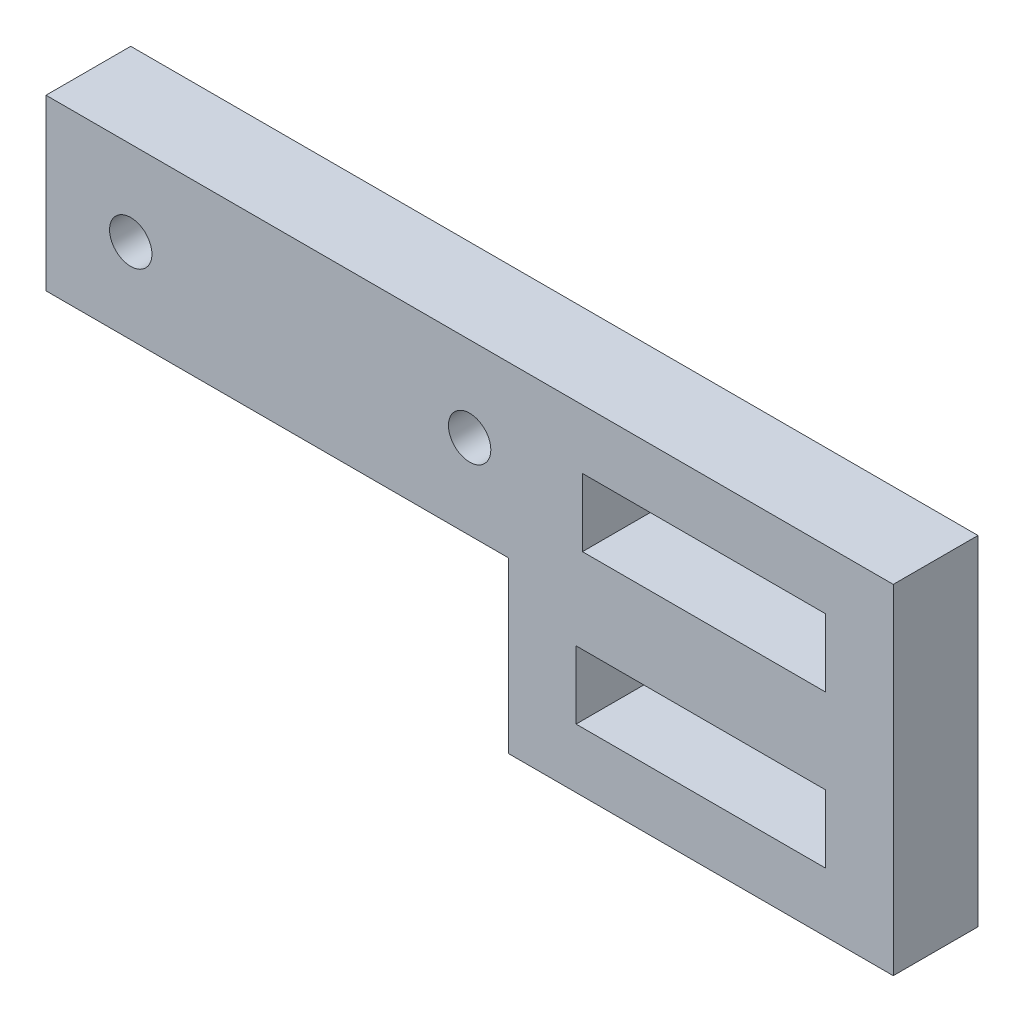
ISO-10303-21;
HEADER;
FILE_DESCRIPTION(('STEP AP214'),'2;1');
FILE_NAME('part.step','',(''),(''),'','','');
FILE_SCHEMA(('AUTOMOTIVE_DESIGN { 1 0 10303 214 1 1 1 1 }'));
ENDSEC;
DATA;
#1=APPLICATION_CONTEXT('core data for automotive mechanical design processes');
#2=APPLICATION_PROTOCOL_DEFINITION('international standard','automotive_design',2000,#1);
#3=PRODUCT_CONTEXT('',#1,'mechanical');
#4=PRODUCT('Part','Part','',(#3));
#5=PRODUCT_RELATED_PRODUCT_CATEGORY('part','',(#4));
#6=PRODUCT_DEFINITION_FORMATION('','',#4);
#7=PRODUCT_DEFINITION_CONTEXT('part definition',#1,'design');
#8=PRODUCT_DEFINITION('design','',#6,#7);
#9=PRODUCT_DEFINITION_SHAPE('','',#8);
#10=(LENGTH_UNIT() NAMED_UNIT(*) SI_UNIT(.MILLI.,.METRE.));
#11=(NAMED_UNIT(*) PLANE_ANGLE_UNIT() SI_UNIT($,.RADIAN.));
#12=(NAMED_UNIT(*) SI_UNIT($,.STERADIAN.) SOLID_ANGLE_UNIT());
#13=UNCERTAINTY_MEASURE_WITH_UNIT(LENGTH_MEASURE(1.E-05),#10,'distance_accuracy_value','');
#14=(GEOMETRIC_REPRESENTATION_CONTEXT(3) GLOBAL_UNCERTAINTY_ASSIGNED_CONTEXT((#13)) GLOBAL_UNIT_ASSIGNED_CONTEXT((#10,
#11,#12)) REPRESENTATION_CONTEXT('',''));
#15=CARTESIAN_POINT('',(0.,0.,0.));
#16=DIRECTION('',(0.,0.,1.));
#17=DIRECTION('',(1.,0.,0.));
#18=AXIS2_PLACEMENT_3D('',#15,#16,#17);
#19=CARTESIAN_POINT('',(-30.2834605430607,-8.38451020186061,6.35));
#20=DIRECTION('',(1.,0.,0.));
#21=DIRECTION('',(0.,1.,0.));
#22=AXIS2_PLACEMENT_3D('',#19,#20,#21);
#23=PLANE('',#22);
#24=DIRECTION('',(0.,-1.,0.));
#25=VECTOR('',#24,1.);
#26=CARTESIAN_POINT('',(-30.2834605430607,-8.38451020186061,0.));
#27=LINE('',#26,#25);
#28=CARTESIAN_POINT('',(-30.2834605430607,4.31548979813939,0.));
#29=VERTEX_POINT('',#28);
#30=CARTESIAN_POINT('',(-30.2834605430607,-8.38451020186061,0.));
#31=VERTEX_POINT('',#30);
#32=EDGE_CURVE('E257',#29,#31,#27,.T.);
#33=ORIENTED_EDGE('',*,*,#32,.T.);
#34=DIRECTION('',(0.,0.,-1.));
#35=VECTOR('',#34,1.);
#36=CARTESIAN_POINT('',(-30.2834605430607,-8.38451020186061,6.35));
#37=LINE('',#36,#35);
#38=CARTESIAN_POINT('',(-30.2834605430607,-8.38451020186061,6.35));
#39=VERTEX_POINT('',#38);
#40=EDGE_CURVE('E11',#39,#31,#37,.T.);
#41=ORIENTED_EDGE('',*,*,#40,.F.);
#42=DIRECTION('',(0.,-1.,0.));
#43=VECTOR('',#42,1.);
#44=CARTESIAN_POINT('',(-30.2834605430607,-8.38451020186061,6.35));
#45=LINE('',#44,#43);
#46=CARTESIAN_POINT('',(-30.2834605430607,4.31548979813939,6.35));
#47=VERTEX_POINT('',#46);
#48=EDGE_CURVE('E236',#47,#39,#45,.T.);
#49=ORIENTED_EDGE('',*,*,#48,.F.);
#50=DIRECTION('',(0.,0.,-1.));
#51=VECTOR('',#50,1.);
#52=CARTESIAN_POINT('',(-30.2834605430607,4.31548979813939,6.35));
#53=LINE('',#52,#51);
#54=EDGE_CURVE('E256',#47,#29,#53,.T.);
#55=ORIENTED_EDGE('',*,*,#54,.T.);
#56=EDGE_LOOP('',(#33,#41,#49,#55));
#57=FACE_BOUND('',#56,.T.);
#58=ADVANCED_FACE('F39',(#57),#23,.F.);
#59=CARTESIAN_POINT('',(4.36322997572279,-8.38451020186061,6.35));
#60=DIRECTION('',(0.,1.,0.));
#61=DIRECTION('',(-1.,0.,0.));
#62=AXIS2_PLACEMENT_3D('',#59,#60,#61);
#63=PLANE('',#62);
#64=DIRECTION('',(1.,0.,0.));
#65=VECTOR('',#64,1.);
#66=CARTESIAN_POINT('',(4.36322997572279,-8.38451020186061,0.));
#67=LINE('',#66,#65);
#68=CARTESIAN_POINT('',(4.36322997572279,-8.38451020186061,0.));
#69=VERTEX_POINT('',#68);
#70=EDGE_CURVE('E261',#31,#69,#67,.T.);
#71=ORIENTED_EDGE('',*,*,#70,.T.);
#72=DIRECTION('',(0.,0.,-1.));
#73=VECTOR('',#72,1.);
#74=CARTESIAN_POINT('',(4.36322997572279,-8.38451020186061,6.35));
#75=LINE('',#74,#73);
#76=CARTESIAN_POINT('',(4.36322997572279,-8.38451020186061,6.35));
#77=VERTEX_POINT('',#76);
#78=EDGE_CURVE('E47',#77,#69,#75,.T.);
#79=ORIENTED_EDGE('',*,*,#78,.F.);
#80=DIRECTION('',(1.,0.,0.));
#81=VECTOR('',#80,1.);
#82=CARTESIAN_POINT('',(4.36322997572279,-8.38451020186061,6.35));
#83=LINE('',#82,#81);
#84=EDGE_CURVE('E240',#39,#77,#83,.T.);
#85=ORIENTED_EDGE('',*,*,#84,.F.);
#86=ORIENTED_EDGE('',*,*,#40,.T.);
#87=EDGE_LOOP('',(#71,#79,#85,#86));
#88=FACE_BOUND('',#87,.T.);
#89=ADVANCED_FACE('F318',(#88),#63,.F.);
#90=CARTESIAN_POINT('',(4.36322997572279,-21.0845102018606,6.35));
#91=DIRECTION('',(1.,0.,0.));
#92=DIRECTION('',(0.,0.,-1.));
#93=AXIS2_PLACEMENT_3D('',#90,#91,#92);
#94=PLANE('',#93);
#95=DIRECTION('',(0.,-1.,0.));
#96=VECTOR('',#95,1.);
#97=CARTESIAN_POINT('',(4.36322997572279,-21.0845102018606,0.));
#98=LINE('',#97,#96);
#99=CARTESIAN_POINT('',(4.36322997572279,-21.0845102018606,0.));
#100=VERTEX_POINT('',#99);
#101=EDGE_CURVE('E265',#69,#100,#98,.T.);
#102=ORIENTED_EDGE('',*,*,#101,.T.);
#103=DIRECTION('',(0.,0.,-1.));
#104=VECTOR('',#103,1.);
#105=CARTESIAN_POINT('',(4.36322997572279,-21.0845102018606,6.35));
#106=LINE('',#105,#104);
#107=CARTESIAN_POINT('',(4.36322997572279,-21.0845102018606,6.35));
#108=VERTEX_POINT('',#107);
#109=EDGE_CURVE('E287',#108,#100,#106,.T.);
#110=ORIENTED_EDGE('',*,*,#109,.F.);
#111=DIRECTION('',(0.,-1.,0.));
#112=VECTOR('',#111,1.);
#113=CARTESIAN_POINT('',(4.36322997572279,-21.0845102018606,6.35));
#114=LINE('',#113,#112);
#115=EDGE_CURVE('E244',#77,#108,#114,.T.);
#116=ORIENTED_EDGE('',*,*,#115,.F.);
#117=ORIENTED_EDGE('',*,*,#78,.T.);
#118=EDGE_LOOP('',(#102,#110,#116,#117));
#119=FACE_BOUND('',#118,.T.);
#120=ADVANCED_FACE('F296',(#119),#94,.F.);
#121=CARTESIAN_POINT('',(33.2165394569393,-21.0845102018606,6.35));
#122=DIRECTION('',(0.,1.,0.));
#123=DIRECTION('',(0.,0.,1.));
#124=AXIS2_PLACEMENT_3D('',#121,#122,#123);
#125=PLANE('',#124);
#126=DIRECTION('',(1.,0.,0.));
#127=VECTOR('',#126,1.);
#128=CARTESIAN_POINT('',(33.2165394569393,-21.0845102018606,0.));
#129=LINE('',#128,#127);
#130=CARTESIAN_POINT('',(33.2165394569393,-21.0845102018606,0.));
#131=VERTEX_POINT('',#130);
#132=EDGE_CURVE('E268',#100,#131,#129,.T.);
#133=ORIENTED_EDGE('',*,*,#132,.T.);
#134=DIRECTION('',(0.,0.,-1.));
#135=VECTOR('',#134,1.);
#136=CARTESIAN_POINT('',(33.2165394569393,-21.0845102018606,6.35));
#137=LINE('',#136,#135);
#138=CARTESIAN_POINT('',(33.2165394569393,-21.0845102018606,6.35));
#139=VERTEX_POINT('',#138);
#140=EDGE_CURVE('E283',#139,#131,#137,.T.);
#141=ORIENTED_EDGE('',*,*,#140,.F.);
#142=DIRECTION('',(1.,0.,0.));
#143=VECTOR('',#142,1.);
#144=CARTESIAN_POINT('',(33.2165394569393,-21.0845102018606,6.35));
#145=LINE('',#144,#143);
#146=EDGE_CURVE('E247',#108,#139,#145,.T.);
#147=ORIENTED_EDGE('',*,*,#146,.F.);
#148=ORIENTED_EDGE('',*,*,#109,.T.);
#149=EDGE_LOOP('',(#133,#141,#147,#148));
#150=FACE_BOUND('',#149,.T.);
#151=ADVANCED_FACE('F306',(#150),#125,.F.);
#152=CARTESIAN_POINT('',(33.2165394569393,4.31548979813939,6.35));
#153=DIRECTION('',(-1.,0.,0.));
#154=DIRECTION('',(0.,-1.,0.));
#155=AXIS2_PLACEMENT_3D('',#152,#153,#154);
#156=PLANE('',#155);
#157=DIRECTION('',(0.,1.,0.));
#158=VECTOR('',#157,1.);
#159=CARTESIAN_POINT('',(33.2165394569393,4.31548979813939,0.));
#160=LINE('',#159,#158);
#161=CARTESIAN_POINT('',(33.2165394569393,4.31548979813939,0.));
#162=VERTEX_POINT('',#161);
#163=EDGE_CURVE('E271',#131,#162,#160,.T.);
#164=ORIENTED_EDGE('',*,*,#163,.T.);
#165=DIRECTION('',(0.,0.,-1.));
#166=VECTOR('',#165,1.);
#167=CARTESIAN_POINT('',(33.2165394569393,4.31548979813939,6.35));
#168=LINE('',#167,#166);
#169=CARTESIAN_POINT('',(33.2165394569393,4.31548979813939,6.35));
#170=VERTEX_POINT('',#169);
#171=EDGE_CURVE('E279',#170,#162,#168,.T.);
#172=ORIENTED_EDGE('',*,*,#171,.F.);
#173=DIRECTION('',(0.,1.,0.));
#174=VECTOR('',#173,1.);
#175=CARTESIAN_POINT('',(33.2165394569393,4.31548979813939,6.35));
#176=LINE('',#175,#174);
#177=EDGE_CURVE('E250',#139,#170,#176,.T.);
#178=ORIENTED_EDGE('',*,*,#177,.F.);
#179=ORIENTED_EDGE('',*,*,#140,.T.);
#180=EDGE_LOOP('',(#164,#172,#178,#179));
#181=FACE_BOUND('',#180,.T.);
#182=ADVANCED_FACE('F310',(#181),#156,.F.);
#183=CARTESIAN_POINT('',(-30.2834605430607,4.31548979813939,6.35));
#184=DIRECTION('',(0.,-1.,0.));
#185=DIRECTION('',(0.,0.,-1.));
#186=AXIS2_PLACEMENT_3D('',#183,#184,#185);
#187=PLANE('',#186);
#188=DIRECTION('',(-1.,0.,0.));
#189=VECTOR('',#188,1.);
#190=CARTESIAN_POINT('',(-30.2834605430607,4.31548979813939,0.));
#191=LINE('',#190,#189);
#192=EDGE_CURVE('E241',#162,#29,#191,.T.);
#193=ORIENTED_EDGE('',*,*,#192,.T.);
#194=ORIENTED_EDGE('',*,*,#54,.F.);
#195=DIRECTION('',(-1.,0.,0.));
#196=VECTOR('',#195,1.);
#197=CARTESIAN_POINT('',(-30.2834605430607,4.31548979813939,6.35));
#198=LINE('',#197,#196);
#199=EDGE_CURVE('E253',#170,#47,#198,.T.);
#200=ORIENTED_EDGE('',*,*,#199,.F.);
#201=ORIENTED_EDGE('',*,*,#171,.T.);
#202=EDGE_LOOP('',(#193,#194,#200,#201));
#203=FACE_BOUND('',#202,.T.);
#204=ADVANCED_FACE('F321',(#203),#187,.F.);
#205=CARTESIAN_POINT('',(0.,0.,6.35));
#206=DIRECTION('',(0.,0.,-1.));
#207=DIRECTION('',(-1.,0.,0.));
#208=AXIS2_PLACEMENT_3D('',#205,#206,#207);
#209=PLANE('',#208);
#210=CARTESIAN_POINT('',(-23.9334605430607,-2.03451020186061,6.35));
#211=DIRECTION('',(0.,0.,1.));
#212=DIRECTION('',(1.,0.,0.));
#213=AXIS2_PLACEMENT_3D('',#210,#211,#212);
#214=CIRCLE('',#213,1.5875);
#215=CARTESIAN_POINT('',(-22.3459605430607,-2.03451020186061,6.35));
#216=VERTEX_POINT('',#215);
#217=EDGE_CURVE('E472',#216,#216,#214,.T.);
#218=ORIENTED_EDGE('',*,*,#217,.F.);
#219=EDGE_LOOP('',(#218));
#220=FACE_BOUND('',#219,.T.);
#221=CARTESIAN_POINT('',(1.46653945693926,-2.03451020186061,6.35));
#222=DIRECTION('',(0.,0.,1.));
#223=DIRECTION('',(1.,0.,0.));
#224=AXIS2_PLACEMENT_3D('',#221,#222,#223);
#225=CIRCLE('',#224,1.5875);
#226=CARTESIAN_POINT('',(3.05403945693926,-2.03451020186061,6.35));
#227=VERTEX_POINT('',#226);
#228=EDGE_CURVE('E171',#227,#227,#225,.T.);
#229=ORIENTED_EDGE('',*,*,#228,.F.);
#230=EDGE_LOOP('',(#229));
#231=FACE_BOUND('',#230,.T.);
#232=DIRECTION('',(1.,0.,0.));
#233=VECTOR('',#232,1.);
#234=CARTESIAN_POINT('',(9.92174151548982,-5.20951020186061,6.35));
#235=LINE('',#234,#233);
#236=CARTESIAN_POINT('',(9.92174151548982,-5.20951020186061,6.35));
#237=VERTEX_POINT('',#236);
#238=CARTESIAN_POINT('',(28.1365394569393,-5.20951020186061,6.35));
#239=VERTEX_POINT('',#238);
#240=EDGE_CURVE('E180',#237,#239,#235,.T.);
#241=ORIENTED_EDGE('',*,*,#240,.F.);
#242=DIRECTION('',(0.,-1.,0.));
#243=VECTOR('',#242,1.);
#244=CARTESIAN_POINT('',(9.92174151548982,-0.129510201860606,6.35));
#245=LINE('',#244,#243);
#246=CARTESIAN_POINT('',(9.92174151548982,-0.129510201860606,6.35));
#247=VERTEX_POINT('',#246);
#248=EDGE_CURVE('E54',#247,#237,#245,.T.);
#249=ORIENTED_EDGE('',*,*,#248,.F.);
#250=DIRECTION('',(-1.,0.,0.));
#251=VECTOR('',#250,1.);
#252=CARTESIAN_POINT('',(9.92174151548982,-0.129510201860606,6.35));
#253=LINE('',#252,#251);
#254=CARTESIAN_POINT('',(28.1365394569393,-0.129510201860606,6.35));
#255=VERTEX_POINT('',#254);
#256=EDGE_CURVE('E164',#255,#247,#253,.T.);
#257=ORIENTED_EDGE('',*,*,#256,.F.);
#258=DIRECTION('',(0.,1.,0.));
#259=VECTOR('',#258,1.);
#260=CARTESIAN_POINT('',(28.1365394569393,-0.129510201860606,6.35));
#261=LINE('',#260,#259);
#262=EDGE_CURVE('E168',#239,#255,#261,.T.);
#263=ORIENTED_EDGE('',*,*,#262,.F.);
#264=EDGE_LOOP('',(#241,#249,#257,#263));
#265=FACE_BOUND('',#264,.T.);
#266=DIRECTION('',(1.,0.,0.));
#267=VECTOR('',#266,1.);
#268=CARTESIAN_POINT('',(9.4432299757228,-16.6395102018606,6.35));
#269=LINE('',#268,#267);
#270=CARTESIAN_POINT('',(9.4432299757228,-16.6395102018606,6.35));
#271=VERTEX_POINT('',#270);
#272=CARTESIAN_POINT('',(28.1365394569393,-16.6395102018606,6.35));
#273=VERTEX_POINT('',#272);
#274=EDGE_CURVE('E215',#271,#273,#269,.T.);
#275=ORIENTED_EDGE('',*,*,#274,.F.);
#276=DIRECTION('',(0.,-1.,0.));
#277=VECTOR('',#276,1.);
#278=CARTESIAN_POINT('',(9.4432299757228,-11.5595102018606,6.35));
#279=LINE('',#278,#277);
#280=CARTESIAN_POINT('',(9.4432299757228,-11.5595102018606,6.35));
#281=VERTEX_POINT('',#280);
#282=EDGE_CURVE('E62',#281,#271,#279,.T.);
#283=ORIENTED_EDGE('',*,*,#282,.F.);
#284=DIRECTION('',(-1.,0.,0.));
#285=VECTOR('',#284,1.);
#286=CARTESIAN_POINT('',(9.4432299757228,-11.5595102018606,6.35));
#287=LINE('',#286,#285);
#288=CARTESIAN_POINT('',(28.1365394569393,-11.5595102018606,6.35));
#289=VERTEX_POINT('',#288);
#290=EDGE_CURVE('E200',#289,#281,#287,.T.);
#291=ORIENTED_EDGE('',*,*,#290,.F.);
#292=DIRECTION('',(0.,1.,0.));
#293=VECTOR('',#292,1.);
#294=CARTESIAN_POINT('',(28.1365394569393,-11.5595102018606,6.35));
#295=LINE('',#294,#293);
#296=EDGE_CURVE('E219',#273,#289,#295,.T.);
#297=ORIENTED_EDGE('',*,*,#296,.F.);
#298=EDGE_LOOP('',(#275,#283,#291,#297));
#299=FACE_BOUND('',#298,.T.);
#300=ORIENTED_EDGE('',*,*,#48,.T.);
#301=ORIENTED_EDGE('',*,*,#84,.T.);
#302=ORIENTED_EDGE('',*,*,#115,.T.);
#303=ORIENTED_EDGE('',*,*,#146,.T.);
#304=ORIENTED_EDGE('',*,*,#177,.T.);
#305=ORIENTED_EDGE('',*,*,#199,.T.);
#306=EDGE_LOOP('',(#300,#301,#302,#303,#304,#305));
#307=FACE_BOUND('',#306,.T.);
#308=ADVANCED_FACE('F314',(#220,#231,#265,#299,#307),#209,.F.);
#309=CARTESIAN_POINT('',(0.,0.,0.));
#310=DIRECTION('',(0.,0.,-1.));
#311=DIRECTION('',(-1.,0.,0.));
#312=AXIS2_PLACEMENT_3D('',#309,#310,#311);
#313=PLANE('',#312);
#314=CARTESIAN_POINT('',(-23.9334605430607,-2.03451020186061,0.));
#315=DIRECTION('',(0.,0.,1.));
#316=DIRECTION('',(1.,0.,0.));
#317=AXIS2_PLACEMENT_3D('',#314,#315,#316);
#318=CIRCLE('',#317,1.5875);
#319=CARTESIAN_POINT('',(-22.3459605430607,-2.03451020186061,0.));
#320=VERTEX_POINT('',#319);
#321=EDGE_CURVE('E262',#320,#320,#318,.T.);
#322=ORIENTED_EDGE('',*,*,#321,.T.);
#323=EDGE_LOOP('',(#322));
#324=FACE_BOUND('',#323,.T.);
#325=CARTESIAN_POINT('',(1.46653945693926,-2.03451020186061,0.));
#326=DIRECTION('',(0.,0.,1.));
#327=DIRECTION('',(1.,0.,0.));
#328=AXIS2_PLACEMENT_3D('',#325,#326,#327);
#329=CIRCLE('',#328,1.5875);
#330=CARTESIAN_POINT('',(3.05403945693926,-2.03451020186061,0.));
#331=VERTEX_POINT('',#330);
#332=EDGE_CURVE('E474',#331,#331,#329,.T.);
#333=ORIENTED_EDGE('',*,*,#332,.T.);
#334=EDGE_LOOP('',(#333));
#335=FACE_BOUND('',#334,.T.);
#336=DIRECTION('',(0.,-1.,0.));
#337=VECTOR('',#336,1.);
#338=CARTESIAN_POINT('',(9.92174151548982,-0.129510201860606,0.));
#339=LINE('',#338,#337);
#340=CARTESIAN_POINT('',(9.92174151548982,-0.129510201860606,0.));
#341=VERTEX_POINT('',#340);
#342=CARTESIAN_POINT('',(9.92174151548982,-5.20951020186061,0.));
#343=VERTEX_POINT('',#342);
#344=EDGE_CURVE('E142',#341,#343,#339,.T.);
#345=ORIENTED_EDGE('',*,*,#344,.T.);
#346=DIRECTION('',(1.,0.,0.));
#347=VECTOR('',#346,1.);
#348=CARTESIAN_POINT('',(9.92174151548982,-5.20951020186061,0.));
#349=LINE('',#348,#347);
#350=CARTESIAN_POINT('',(28.1365394569393,-5.20951020186061,0.));
#351=VERTEX_POINT('',#350);
#352=EDGE_CURVE('E153',#343,#351,#349,.T.);
#353=ORIENTED_EDGE('',*,*,#352,.T.);
#354=DIRECTION('',(0.,1.,0.));
#355=VECTOR('',#354,1.);
#356=CARTESIAN_POINT('',(28.1365394569393,-0.129510201860606,0.));
#357=LINE('',#356,#355);
#358=CARTESIAN_POINT('',(28.1365394569393,-0.129510201860606,0.));
#359=VERTEX_POINT('',#358);
#360=EDGE_CURVE('E158',#351,#359,#357,.T.);
#361=ORIENTED_EDGE('',*,*,#360,.T.);
#362=DIRECTION('',(-1.,0.,0.));
#363=VECTOR('',#362,1.);
#364=CARTESIAN_POINT('',(9.92174151548982,-0.129510201860606,0.));
#365=LINE('',#364,#363);
#366=EDGE_CURVE('E149',#359,#341,#365,.T.);
#367=ORIENTED_EDGE('',*,*,#366,.T.);
#368=EDGE_LOOP('',(#345,#353,#361,#367));
#369=FACE_BOUND('',#368,.T.);
#370=DIRECTION('',(0.,-1.,0.));
#371=VECTOR('',#370,1.);
#372=CARTESIAN_POINT('',(9.4432299757228,-11.5595102018606,0.));
#373=LINE('',#372,#371);
#374=CARTESIAN_POINT('',(9.4432299757228,-11.5595102018606,0.));
#375=VERTEX_POINT('',#374);
#376=CARTESIAN_POINT('',(9.4432299757228,-16.6395102018606,0.));
#377=VERTEX_POINT('',#376);
#378=EDGE_CURVE('E195',#375,#377,#373,.T.);
#379=ORIENTED_EDGE('',*,*,#378,.T.);
#380=DIRECTION('',(1.,0.,0.));
#381=VECTOR('',#380,1.);
#382=CARTESIAN_POINT('',(9.4432299757228,-16.6395102018606,0.));
#383=LINE('',#382,#381);
#384=CARTESIAN_POINT('',(28.1365394569393,-16.6395102018606,0.));
#385=VERTEX_POINT('',#384);
#386=EDGE_CURVE('E199',#377,#385,#383,.T.);
#387=ORIENTED_EDGE('',*,*,#386,.T.);
#388=DIRECTION('',(0.,1.,0.));
#389=VECTOR('',#388,1.);
#390=CARTESIAN_POINT('',(28.1365394569393,-11.5595102018606,0.));
#391=LINE('',#390,#389);
#392=CARTESIAN_POINT('',(28.1365394569393,-11.5595102018606,0.));
#393=VERTEX_POINT('',#392);
#394=EDGE_CURVE('E204',#385,#393,#391,.T.);
#395=ORIENTED_EDGE('',*,*,#394,.T.);
#396=DIRECTION('',(-1.,0.,0.));
#397=VECTOR('',#396,1.);
#398=CARTESIAN_POINT('',(9.4432299757228,-11.5595102018606,0.));
#399=LINE('',#398,#397);
#400=EDGE_CURVE('E208',#393,#375,#399,.T.);
#401=ORIENTED_EDGE('',*,*,#400,.T.);
#402=EDGE_LOOP('',(#379,#387,#395,#401));
#403=FACE_BOUND('',#402,.T.);
#404=ORIENTED_EDGE('',*,*,#32,.F.);
#405=ORIENTED_EDGE('',*,*,#192,.F.);
#406=ORIENTED_EDGE('',*,*,#163,.F.);
#407=ORIENTED_EDGE('',*,*,#132,.F.);
#408=ORIENTED_EDGE('',*,*,#101,.F.);
#409=ORIENTED_EDGE('',*,*,#70,.F.);
#410=EDGE_LOOP('',(#404,#405,#406,#407,#408,#409));
#411=FACE_BOUND('',#410,.T.);
#412=ADVANCED_FACE('F160',(#324,#335,#369,#403,#411),#313,.T.);
#413=CARTESIAN_POINT('',(9.4432299757228,-11.5595102018606,0.));
#414=DIRECTION('',(-1.,0.,0.));
#415=DIRECTION('',(0.,0.,1.));
#416=AXIS2_PLACEMENT_3D('',#413,#414,#415);
#417=PLANE('',#416);
#418=ORIENTED_EDGE('',*,*,#282,.T.);
#419=DIRECTION('',(0.,0.,1.));
#420=VECTOR('',#419,1.);
#421=CARTESIAN_POINT('',(9.4432299757228,-16.6395102018606,0.));
#422=LINE('',#421,#420);
#423=EDGE_CURVE('E212',#377,#271,#422,.T.);
#424=ORIENTED_EDGE('',*,*,#423,.F.);
#425=ORIENTED_EDGE('',*,*,#378,.F.);
#426=DIRECTION('',(0.,0.,1.));
#427=VECTOR('',#426,1.);
#428=CARTESIAN_POINT('',(9.4432299757228,-11.5595102018606,0.));
#429=LINE('',#428,#427);
#430=EDGE_CURVE('E181',#375,#281,#429,.T.);
#431=ORIENTED_EDGE('',*,*,#430,.T.);
#432=EDGE_LOOP('',(#418,#424,#425,#431));
#433=FACE_BOUND('',#432,.T.);
#434=ADVANCED_FACE('F369',(#433),#417,.F.);
#435=CARTESIAN_POINT('',(9.4432299757228,-11.5595102018606,0.));
#436=DIRECTION('',(0.,1.,0.));
#437=DIRECTION('',(0.,0.,1.));
#438=AXIS2_PLACEMENT_3D('',#435,#436,#437);
#439=PLANE('',#438);
#440=ORIENTED_EDGE('',*,*,#290,.T.);
#441=ORIENTED_EDGE('',*,*,#430,.F.);
#442=ORIENTED_EDGE('',*,*,#400,.F.);
#443=DIRECTION('',(0.,0.,1.));
#444=VECTOR('',#443,1.);
#445=CARTESIAN_POINT('',(28.1365394569393,-11.5595102018606,0.));
#446=LINE('',#445,#444);
#447=EDGE_CURVE('E228',#393,#289,#446,.T.);
#448=ORIENTED_EDGE('',*,*,#447,.T.);
#449=EDGE_LOOP('',(#440,#441,#442,#448));
#450=FACE_BOUND('',#449,.T.);
#451=ADVANCED_FACE('F378',(#450),#439,.F.);
#452=CARTESIAN_POINT('',(28.1365394569393,-11.5595102018606,0.));
#453=DIRECTION('',(1.,0.,0.));
#454=DIRECTION('',(0.,1.,0.));
#455=AXIS2_PLACEMENT_3D('',#452,#453,#454);
#456=PLANE('',#455);
#457=ORIENTED_EDGE('',*,*,#296,.T.);
#458=ORIENTED_EDGE('',*,*,#447,.F.);
#459=ORIENTED_EDGE('',*,*,#394,.F.);
#460=DIRECTION('',(0.,0.,1.));
#461=VECTOR('',#460,1.);
#462=CARTESIAN_POINT('',(28.1365394569393,-16.6395102018606,0.));
#463=LINE('',#462,#461);
#464=EDGE_CURVE('E231',#385,#273,#463,.T.);
#465=ORIENTED_EDGE('',*,*,#464,.T.);
#466=EDGE_LOOP('',(#457,#458,#459,#465));
#467=FACE_BOUND('',#466,.T.);
#468=ADVANCED_FACE('F387',(#467),#456,.F.);
#469=CARTESIAN_POINT('',(9.4432299757228,-16.6395102018606,0.));
#470=DIRECTION('',(0.,-1.,0.));
#471=DIRECTION('',(0.,0.,-1.));
#472=AXIS2_PLACEMENT_3D('',#469,#470,#471);
#473=PLANE('',#472);
#474=ORIENTED_EDGE('',*,*,#274,.T.);
#475=ORIENTED_EDGE('',*,*,#464,.F.);
#476=ORIENTED_EDGE('',*,*,#386,.F.);
#477=ORIENTED_EDGE('',*,*,#423,.T.);
#478=EDGE_LOOP('',(#474,#475,#476,#477));
#479=FACE_BOUND('',#478,.T.);
#480=ADVANCED_FACE('F397',(#479),#473,.F.);
#481=CARTESIAN_POINT('',(9.92174151548982,-0.129510201860606,0.));
#482=DIRECTION('',(-1.,0.,0.));
#483=DIRECTION('',(0.,-1.,0.));
#484=AXIS2_PLACEMENT_3D('',#481,#482,#483);
#485=PLANE('',#484);
#486=ORIENTED_EDGE('',*,*,#248,.T.);
#487=DIRECTION('',(0.,0.,1.));
#488=VECTOR('',#487,1.);
#489=CARTESIAN_POINT('',(9.92174151548982,-5.20951020186061,0.));
#490=LINE('',#489,#488);
#491=EDGE_CURVE('E138',#343,#237,#490,.T.);
#492=ORIENTED_EDGE('',*,*,#491,.F.);
#493=ORIENTED_EDGE('',*,*,#344,.F.);
#494=DIRECTION('',(0.,0.,1.));
#495=VECTOR('',#494,1.);
#496=CARTESIAN_POINT('',(9.92174151548982,-0.129510201860606,0.));
#497=LINE('',#496,#495);
#498=EDGE_CURVE('E187',#341,#247,#497,.T.);
#499=ORIENTED_EDGE('',*,*,#498,.T.);
#500=EDGE_LOOP('',(#486,#492,#493,#499));
#501=FACE_BOUND('',#500,.T.);
#502=ADVANCED_FACE('F140',(#501),#485,.F.);
#503=CARTESIAN_POINT('',(9.92174151548982,-0.129510201860606,0.));
#504=DIRECTION('',(0.,1.,0.));
#505=DIRECTION('',(0.,0.,1.));
#506=AXIS2_PLACEMENT_3D('',#503,#504,#505);
#507=PLANE('',#506);
#508=ORIENTED_EDGE('',*,*,#256,.T.);
#509=ORIENTED_EDGE('',*,*,#498,.F.);
#510=ORIENTED_EDGE('',*,*,#366,.F.);
#511=DIRECTION('',(0.,0.,1.));
#512=VECTOR('',#511,1.);
#513=CARTESIAN_POINT('',(28.1365394569393,-0.129510201860606,0.));
#514=LINE('',#513,#512);
#515=EDGE_CURVE('E190',#359,#255,#514,.T.);
#516=ORIENTED_EDGE('',*,*,#515,.T.);
#517=EDGE_LOOP('',(#508,#509,#510,#516));
#518=FACE_BOUND('',#517,.T.);
#519=ADVANCED_FACE('F416',(#518),#507,.F.);
#520=CARTESIAN_POINT('',(28.1365394569393,-0.129510201860606,0.));
#521=DIRECTION('',(1.,0.,0.));
#522=DIRECTION('',(0.,0.,-1.));
#523=AXIS2_PLACEMENT_3D('',#520,#521,#522);
#524=PLANE('',#523);
#525=ORIENTED_EDGE('',*,*,#262,.T.);
#526=ORIENTED_EDGE('',*,*,#515,.F.);
#527=ORIENTED_EDGE('',*,*,#360,.F.);
#528=DIRECTION('',(0.,0.,1.));
#529=VECTOR('',#528,1.);
#530=CARTESIAN_POINT('',(28.1365394569393,-5.20951020186061,0.));
#531=LINE('',#530,#529);
#532=EDGE_CURVE('E148',#351,#239,#531,.T.);
#533=ORIENTED_EDGE('',*,*,#532,.T.);
#534=EDGE_LOOP('',(#525,#526,#527,#533));
#535=FACE_BOUND('',#534,.T.);
#536=ADVANCED_FACE('F425',(#535),#524,.F.);
#537=CARTESIAN_POINT('',(9.92174151548982,-5.20951020186061,0.));
#538=DIRECTION('',(0.,-1.,0.));
#539=DIRECTION('',(0.,0.,-1.));
#540=AXIS2_PLACEMENT_3D('',#537,#538,#539);
#541=PLANE('',#540);
#542=ORIENTED_EDGE('',*,*,#240,.T.);
#543=ORIENTED_EDGE('',*,*,#532,.F.);
#544=ORIENTED_EDGE('',*,*,#352,.F.);
#545=ORIENTED_EDGE('',*,*,#491,.T.);
#546=EDGE_LOOP('',(#542,#543,#544,#545));
#547=FACE_BOUND('',#546,.T.);
#548=ADVANCED_FACE('F154',(#547),#541,.F.);
#549=CARTESIAN_POINT('',(1.46653945693926,-2.03451020186061,0.));
#550=DIRECTION('',(0.,0.,1.));
#551=DIRECTION('',(1.,0.,0.));
#552=AXIS2_PLACEMENT_3D('',#549,#550,#551);
#553=CYLINDRICAL_SURFACE('',#552,1.5875);
#554=ORIENTED_EDGE('',*,*,#332,.F.);
#555=EDGE_LOOP('',(#554));
#556=FACE_BOUND('',#555,.T.);
#557=ORIENTED_EDGE('',*,*,#228,.T.);
#558=EDGE_LOOP('',(#557));
#559=FACE_BOUND('',#558,.T.);
#560=ADVANCED_FACE('F444',(#556,#559),#553,.F.);
#561=CARTESIAN_POINT('',(-23.9334605430607,-2.03451020186061,0.));
#562=DIRECTION('',(0.,0.,1.));
#563=DIRECTION('',(1.,0.,0.));
#564=AXIS2_PLACEMENT_3D('',#561,#562,#563);
#565=CYLINDRICAL_SURFACE('',#564,1.5875);
#566=ORIENTED_EDGE('',*,*,#321,.F.);
#567=EDGE_LOOP('',(#566));
#568=FACE_BOUND('',#567,.T.);
#569=ORIENTED_EDGE('',*,*,#217,.T.);
#570=EDGE_LOOP('',(#569));
#571=FACE_BOUND('',#570,.T.);
#572=ADVANCED_FACE('F453',(#568,#571),#565,.F.);
#573=CLOSED_SHELL('',(#58,#89,#120,#151,#182,#204,#308,#412,#434,#451,#468,#480,#502,#519,#536,
#548,#560,#572));
#574=MANIFOLD_SOLID_BREP('B2',#573);
#575=ADVANCED_BREP_SHAPE_REPRESENTATION('',(#18,#574),#14);
#576=SHAPE_DEFINITION_REPRESENTATION(#9,#575);
ENDSEC;
END-ISO-10303-21;
